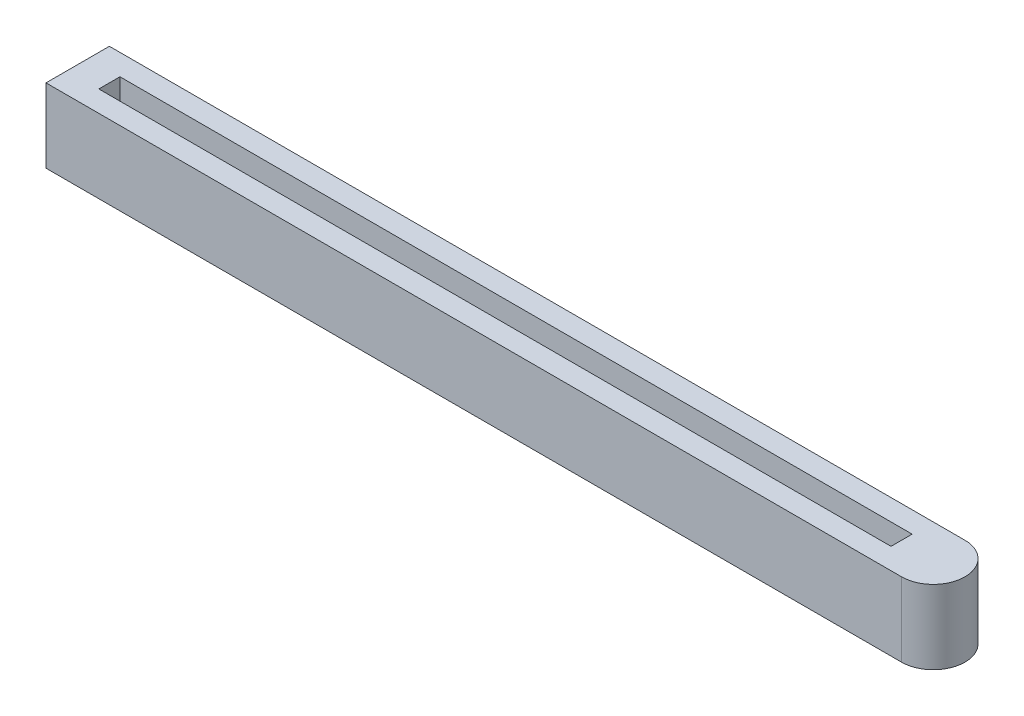
ISO-10303-21;
HEADER;
FILE_DESCRIPTION(('STEP AP214'),'2;1');
FILE_NAME('part.step','',(''),(''),'','','');
FILE_SCHEMA(('AUTOMOTIVE_DESIGN { 1 0 10303 214 1 1 1 1 }'));
ENDSEC;
DATA;
#1=APPLICATION_CONTEXT('core data for automotive mechanical design processes');
#2=APPLICATION_PROTOCOL_DEFINITION('international standard','automotive_design',2000,#1);
#3=PRODUCT_CONTEXT('',#1,'mechanical');
#4=PRODUCT('Part','Part','',(#3));
#5=PRODUCT_RELATED_PRODUCT_CATEGORY('part','',(#4));
#6=PRODUCT_DEFINITION_FORMATION('','',#4);
#7=PRODUCT_DEFINITION_CONTEXT('part definition',#1,'design');
#8=PRODUCT_DEFINITION('design','',#6,#7);
#9=PRODUCT_DEFINITION_SHAPE('','',#8);
#10=(LENGTH_UNIT() NAMED_UNIT(*) SI_UNIT(.MILLI.,.METRE.));
#11=(NAMED_UNIT(*) PLANE_ANGLE_UNIT() SI_UNIT($,.RADIAN.));
#12=(NAMED_UNIT(*) SI_UNIT($,.STERADIAN.) SOLID_ANGLE_UNIT());
#13=UNCERTAINTY_MEASURE_WITH_UNIT(LENGTH_MEASURE(1.E-05),#10,'distance_accuracy_value','');
#14=(GEOMETRIC_REPRESENTATION_CONTEXT(3) GLOBAL_UNCERTAINTY_ASSIGNED_CONTEXT((#13)) GLOBAL_UNIT_ASSIGNED_CONTEXT((#10,
#11,#12)) REPRESENTATION_CONTEXT('',''));
#15=CARTESIAN_POINT('',(0.,0.,0.));
#16=DIRECTION('',(0.,0.,1.));
#17=DIRECTION('',(1.,0.,0.));
#18=AXIS2_PLACEMENT_3D('',#15,#16,#17);
#19=CARTESIAN_POINT('',(0.,3.5,3.));
#20=DIRECTION('',(0.,0.,-1.));
#21=DIRECTION('',(-1.,0.,0.));
#22=AXIS2_PLACEMENT_3D('',#19,#20,#21);
#23=PLANE('',#22);
#24=DIRECTION('',(1.,0.,0.));
#25=VECTOR('',#24,1.);
#26=CARTESIAN_POINT('',(0.,0.,3.));
#27=LINE('',#26,#25);
#28=CARTESIAN_POINT('',(0.,0.,3.));
#29=VERTEX_POINT('',#28);
#30=CARTESIAN_POINT('',(40.5,0.,3.));
#31=VERTEX_POINT('',#30);
#32=EDGE_CURVE('E149',#29,#31,#27,.T.);
#33=ORIENTED_EDGE('',*,*,#32,.T.);
#34=DIRECTION('',(0.,-1.,0.));
#35=VECTOR('',#34,1.);
#36=CARTESIAN_POINT('',(40.5,3.5,3.));
#37=LINE('',#36,#35);
#38=CARTESIAN_POINT('',(40.5,3.5,3.));
#39=VERTEX_POINT('',#38);
#40=EDGE_CURVE('E11',#39,#31,#37,.T.);
#41=ORIENTED_EDGE('',*,*,#40,.F.);
#42=DIRECTION('',(1.,0.,0.));
#43=VECTOR('',#42,1.);
#44=CARTESIAN_POINT('',(0.,3.5,3.));
#45=LINE('',#44,#43);
#46=CARTESIAN_POINT('',(0.,3.5,3.));
#47=VERTEX_POINT('',#46);
#48=EDGE_CURVE('E153',#47,#39,#45,.T.);
#49=ORIENTED_EDGE('',*,*,#48,.F.);
#50=DIRECTION('',(0.,-1.,0.));
#51=VECTOR('',#50,1.);
#52=CARTESIAN_POINT('',(0.,3.5,3.));
#53=LINE('',#52,#51);
#54=EDGE_CURVE('E160',#47,#29,#53,.T.);
#55=ORIENTED_EDGE('',*,*,#54,.T.);
#56=EDGE_LOOP('',(#33,#41,#49,#55));
#57=FACE_BOUND('',#56,.T.);
#58=ADVANCED_FACE('F41',(#57),#23,.F.);
#59=CARTESIAN_POINT('',(40.5,3.5,1.5));
#60=DIRECTION('',(0.,-1.,0.));
#61=DIRECTION('',(0.,0.,-1.));
#62=AXIS2_PLACEMENT_3D('',#59,#60,#61);
#63=CYLINDRICAL_SURFACE('',#62,1.5);
#64=CARTESIAN_POINT('',(40.5,0.,1.5));
#65=DIRECTION('',(0.,1.,0.));
#66=DIRECTION('',(0.,0.,1.));
#67=AXIS2_PLACEMENT_3D('',#64,#65,#66);
#68=CIRCLE('',#67,1.5);
#69=CARTESIAN_POINT('',(40.5,0.,0.));
#70=VERTEX_POINT('',#69);
#71=EDGE_CURVE('E163',#31,#70,#68,.T.);
#72=ORIENTED_EDGE('',*,*,#71,.T.);
#73=DIRECTION('',(0.,-1.,0.));
#74=VECTOR('',#73,1.);
#75=CARTESIAN_POINT('',(40.5,3.5,0.));
#76=LINE('',#75,#74);
#77=CARTESIAN_POINT('',(40.5,3.5,0.));
#78=VERTEX_POINT('',#77);
#79=EDGE_CURVE('E48',#78,#70,#76,.T.);
#80=ORIENTED_EDGE('',*,*,#79,.F.);
#81=CARTESIAN_POINT('',(40.5,3.5,1.5));
#82=DIRECTION('',(0.,1.,0.));
#83=DIRECTION('',(0.,0.,1.));
#84=AXIS2_PLACEMENT_3D('',#81,#82,#83);
#85=CIRCLE('',#84,1.5);
#86=EDGE_CURVE('E92',#39,#78,#85,.T.);
#87=ORIENTED_EDGE('',*,*,#86,.F.);
#88=ORIENTED_EDGE('',*,*,#40,.T.);
#89=EDGE_LOOP('',(#72,#80,#87,#88));
#90=FACE_BOUND('',#89,.T.);
#91=ADVANCED_FACE('F175',(#90),#63,.T.);
#92=CARTESIAN_POINT('',(0.,3.5,0.));
#93=DIRECTION('',(0.,0.,-1.));
#94=DIRECTION('',(-1.,0.,0.));
#95=AXIS2_PLACEMENT_3D('',#92,#93,#94);
#96=PLANE('',#95);
#97=DIRECTION('',(1.,0.,0.));
#98=VECTOR('',#97,1.);
#99=CARTESIAN_POINT('',(0.,0.,0.));
#100=LINE('',#99,#98);
#101=CARTESIAN_POINT('',(0.,0.,0.));
#102=VERTEX_POINT('',#101);
#103=EDGE_CURVE('E166',#102,#70,#100,.T.);
#104=ORIENTED_EDGE('',*,*,#103,.F.);
#105=DIRECTION('',(0.,-1.,0.));
#106=VECTOR('',#105,1.);
#107=CARTESIAN_POINT('',(0.,3.5,0.));
#108=LINE('',#107,#106);
#109=CARTESIAN_POINT('',(0.,3.5,0.));
#110=VERTEX_POINT('',#109);
#111=EDGE_CURVE('E171',#110,#102,#108,.T.);
#112=ORIENTED_EDGE('',*,*,#111,.F.);
#113=DIRECTION('',(1.,0.,0.));
#114=VECTOR('',#113,1.);
#115=CARTESIAN_POINT('',(0.,3.5,0.));
#116=LINE('',#115,#114);
#117=EDGE_CURVE('E156',#110,#78,#116,.T.);
#118=ORIENTED_EDGE('',*,*,#117,.T.);
#119=ORIENTED_EDGE('',*,*,#79,.T.);
#120=EDGE_LOOP('',(#104,#112,#118,#119));
#121=FACE_BOUND('',#120,.T.);
#122=ADVANCED_FACE('F174',(#121),#96,.T.);
#123=CARTESIAN_POINT('',(0.,3.5,0.));
#124=DIRECTION('',(1.,0.,0.));
#125=DIRECTION('',(0.,0.,-1.));
#126=AXIS2_PLACEMENT_3D('',#123,#124,#125);
#127=PLANE('',#126);
#128=DIRECTION('',(0.,0.,1.));
#129=VECTOR('',#128,1.);
#130=CARTESIAN_POINT('',(0.,0.,0.));
#131=LINE('',#130,#129);
#132=EDGE_CURVE('E85',#102,#29,#131,.T.);
#133=ORIENTED_EDGE('',*,*,#132,.T.);
#134=ORIENTED_EDGE('',*,*,#54,.F.);
#135=DIRECTION('',(0.,0.,1.));
#136=VECTOR('',#135,1.);
#137=CARTESIAN_POINT('',(0.,3.5,0.));
#138=LINE('',#137,#136);
#139=EDGE_CURVE('E64',#110,#47,#138,.T.);
#140=ORIENTED_EDGE('',*,*,#139,.F.);
#141=ORIENTED_EDGE('',*,*,#111,.T.);
#142=EDGE_LOOP('',(#133,#134,#140,#141));
#143=FACE_BOUND('',#142,.T.);
#144=ADVANCED_FACE('F182',(#143),#127,.F.);
#145=CARTESIAN_POINT('',(0.,3.5,0.));
#146=DIRECTION('',(0.,1.,0.));
#147=DIRECTION('',(0.,0.,1.));
#148=AXIS2_PLACEMENT_3D('',#145,#146,#147);
#149=PLANE('',#148);
#150=DIRECTION('',(0.,0.,-1.));
#151=VECTOR('',#150,1.);
#152=CARTESIAN_POINT('',(39.0000000000009,3.5,1.99999999999823));
#153=LINE('',#152,#151);
#154=CARTESIAN_POINT('',(39.0000000000009,3.5,1.99999999999823));
#155=VERTEX_POINT('',#154);
#156=CARTESIAN_POINT('',(39.0000000000009,3.5,0.999999999998226));
#157=VERTEX_POINT('',#156);
#158=EDGE_CURVE('E55',#155,#157,#153,.T.);
#159=ORIENTED_EDGE('',*,*,#158,.F.);
#160=DIRECTION('',(1.,0.,0.));
#161=VECTOR('',#160,1.);
#162=CARTESIAN_POINT('',(39.0000000000009,3.5,1.99999999999823));
#163=LINE('',#162,#161);
#164=CARTESIAN_POINT('',(1.50000000000092,3.5,1.99999999999823));
#165=VERTEX_POINT('',#164);
#166=EDGE_CURVE('E134',#165,#155,#163,.T.);
#167=ORIENTED_EDGE('',*,*,#166,.F.);
#168=DIRECTION('',(0.,0.,1.));
#169=VECTOR('',#168,1.);
#170=CARTESIAN_POINT('',(1.50000000000092,3.5,1.99999999999823));
#171=LINE('',#170,#169);
#172=CARTESIAN_POINT('',(1.50000000000092,3.5,0.999999999998226));
#173=VERTEX_POINT('',#172);
#174=EDGE_CURVE('E137',#173,#165,#171,.T.);
#175=ORIENTED_EDGE('',*,*,#174,.F.);
#176=DIRECTION('',(-1.,0.,0.));
#177=VECTOR('',#176,1.);
#178=CARTESIAN_POINT('',(39.0000000000009,3.5,0.999999999998226));
#179=LINE('',#178,#177);
#180=EDGE_CURVE('E143',#157,#173,#179,.T.);
#181=ORIENTED_EDGE('',*,*,#180,.F.);
#182=EDGE_LOOP('',(#159,#167,#175,#181));
#183=FACE_BOUND('',#182,.T.);
#184=ORIENTED_EDGE('',*,*,#48,.T.);
#185=ORIENTED_EDGE('',*,*,#86,.T.);
#186=ORIENTED_EDGE('',*,*,#117,.F.);
#187=ORIENTED_EDGE('',*,*,#139,.T.);
#188=EDGE_LOOP('',(#184,#185,#186,#187));
#189=FACE_BOUND('',#188,.T.);
#190=ADVANCED_FACE('F183',(#183,#189),#149,.T.);
#191=CARTESIAN_POINT('',(0.,0.,0.));
#192=DIRECTION('',(0.,1.,0.));
#193=DIRECTION('',(0.,0.,1.));
#194=AXIS2_PLACEMENT_3D('',#191,#192,#193);
#195=PLANE('',#194);
#196=ORIENTED_EDGE('',*,*,#32,.F.);
#197=ORIENTED_EDGE('',*,*,#132,.F.);
#198=ORIENTED_EDGE('',*,*,#103,.T.);
#199=ORIENTED_EDGE('',*,*,#71,.F.);
#200=EDGE_LOOP('',(#196,#197,#198,#199));
#201=FACE_BOUND('',#200,.T.);
#202=ADVANCED_FACE('F179',(#201),#195,.F.);
#203=CARTESIAN_POINT('',(39.0000000000009,2.,1.99999999999823));
#204=DIRECTION('',(1.,0.,0.));
#205=DIRECTION('',(0.,0.,-1.));
#206=AXIS2_PLACEMENT_3D('',#203,#204,#205);
#207=PLANE('',#206);
#208=ORIENTED_EDGE('',*,*,#158,.T.);
#209=DIRECTION('',(0.,1.,0.));
#210=VECTOR('',#209,1.);
#211=CARTESIAN_POINT('',(39.0000000000009,2.,0.999999999998226));
#212=LINE('',#211,#210);
#213=CARTESIAN_POINT('',(39.0000000000009,2.,0.999999999998226));
#214=VERTEX_POINT('',#213);
#215=EDGE_CURVE('E112',#214,#157,#212,.T.);
#216=ORIENTED_EDGE('',*,*,#215,.F.);
#217=DIRECTION('',(0.,0.,-1.));
#218=VECTOR('',#217,1.);
#219=CARTESIAN_POINT('',(39.0000000000009,2.,1.99999999999823));
#220=LINE('',#219,#218);
#221=CARTESIAN_POINT('',(39.0000000000009,2.,1.99999999999823));
#222=VERTEX_POINT('',#221);
#223=EDGE_CURVE('E116',#222,#214,#220,.T.);
#224=ORIENTED_EDGE('',*,*,#223,.F.);
#225=DIRECTION('',(0.,1.,0.));
#226=VECTOR('',#225,1.);
#227=CARTESIAN_POINT('',(39.0000000000009,2.,1.99999999999823));
#228=LINE('',#227,#226);
#229=EDGE_CURVE('E147',#222,#155,#228,.T.);
#230=ORIENTED_EDGE('',*,*,#229,.T.);
#231=EDGE_LOOP('',(#208,#216,#224,#230));
#232=FACE_BOUND('',#231,.T.);
#233=ADVANCED_FACE('F114',(#232),#207,.F.);
#234=CARTESIAN_POINT('',(39.0000000000009,2.,1.99999999999823));
#235=DIRECTION('',(0.,0.,1.));
#236=DIRECTION('',(1.,0.,0.));
#237=AXIS2_PLACEMENT_3D('',#234,#235,#236);
#238=PLANE('',#237);
#239=ORIENTED_EDGE('',*,*,#166,.T.);
#240=ORIENTED_EDGE('',*,*,#229,.F.);
#241=DIRECTION('',(1.,0.,0.));
#242=VECTOR('',#241,1.);
#243=CARTESIAN_POINT('',(39.0000000000009,2.,1.99999999999823));
#244=LINE('',#243,#242);
#245=CARTESIAN_POINT('',(1.50000000000092,2.,1.99999999999823));
#246=VERTEX_POINT('',#245);
#247=EDGE_CURVE('E122',#246,#222,#244,.T.);
#248=ORIENTED_EDGE('',*,*,#247,.F.);
#249=DIRECTION('',(0.,1.,0.));
#250=VECTOR('',#249,1.);
#251=CARTESIAN_POINT('',(1.50000000000092,2.,1.99999999999823));
#252=LINE('',#251,#250);
#253=EDGE_CURVE('E150',#246,#165,#252,.T.);
#254=ORIENTED_EDGE('',*,*,#253,.T.);
#255=EDGE_LOOP('',(#239,#240,#248,#254));
#256=FACE_BOUND('',#255,.T.);
#257=ADVANCED_FACE('F224',(#256),#238,.F.);
#258=CARTESIAN_POINT('',(1.50000000000092,2.,1.99999999999823));
#259=DIRECTION('',(-1.,0.,0.));
#260=DIRECTION('',(0.,0.,1.));
#261=AXIS2_PLACEMENT_3D('',#258,#259,#260);
#262=PLANE('',#261);
#263=ORIENTED_EDGE('',*,*,#174,.T.);
#264=ORIENTED_EDGE('',*,*,#253,.F.);
#265=DIRECTION('',(0.,0.,1.));
#266=VECTOR('',#265,1.);
#267=CARTESIAN_POINT('',(1.50000000000092,2.,1.99999999999823));
#268=LINE('',#267,#266);
#269=CARTESIAN_POINT('',(1.50000000000092,2.,0.999999999998226));
#270=VERTEX_POINT('',#269);
#271=EDGE_CURVE('E130',#270,#246,#268,.T.);
#272=ORIENTED_EDGE('',*,*,#271,.F.);
#273=DIRECTION('',(0.,1.,0.));
#274=VECTOR('',#273,1.);
#275=CARTESIAN_POINT('',(1.50000000000092,2.,0.999999999998226));
#276=LINE('',#275,#274);
#277=EDGE_CURVE('E121',#270,#173,#276,.T.);
#278=ORIENTED_EDGE('',*,*,#277,.T.);
#279=EDGE_LOOP('',(#263,#264,#272,#278));
#280=FACE_BOUND('',#279,.T.);
#281=ADVANCED_FACE('F230',(#280),#262,.F.);
#282=CARTESIAN_POINT('',(39.0000000000009,2.,0.999999999998226));
#283=DIRECTION('',(0.,0.,-1.));
#284=DIRECTION('',(-1.,0.,0.));
#285=AXIS2_PLACEMENT_3D('',#282,#283,#284);
#286=PLANE('',#285);
#287=ORIENTED_EDGE('',*,*,#180,.T.);
#288=ORIENTED_EDGE('',*,*,#277,.F.);
#289=DIRECTION('',(-1.,0.,0.));
#290=VECTOR('',#289,1.);
#291=CARTESIAN_POINT('',(39.0000000000009,2.,0.999999999998226));
#292=LINE('',#291,#290);
#293=EDGE_CURVE('E125',#214,#270,#292,.T.);
#294=ORIENTED_EDGE('',*,*,#293,.F.);
#295=ORIENTED_EDGE('',*,*,#215,.T.);
#296=EDGE_LOOP('',(#287,#288,#294,#295));
#297=FACE_BOUND('',#296,.T.);
#298=ADVANCED_FACE('F126',(#297),#286,.F.);
#299=CARTESIAN_POINT('',(0.,2.,0.));
#300=DIRECTION('',(0.,1.,0.));
#301=DIRECTION('',(0.,0.,1.));
#302=AXIS2_PLACEMENT_3D('',#299,#300,#301);
#303=PLANE('',#302);
#304=ORIENTED_EDGE('',*,*,#223,.T.);
#305=ORIENTED_EDGE('',*,*,#293,.T.);
#306=ORIENTED_EDGE('',*,*,#271,.T.);
#307=ORIENTED_EDGE('',*,*,#247,.T.);
#308=EDGE_LOOP('',(#304,#305,#306,#307));
#309=FACE_BOUND('',#308,.T.);
#310=ADVANCED_FACE('F132',(#309),#303,.T.);
#311=CLOSED_SHELL('',(#58,#91,#122,#144,#190,#202,#233,#257,#281,#298,#310));
#312=MANIFOLD_SOLID_BREP('B2',#311);
#313=ADVANCED_BREP_SHAPE_REPRESENTATION('',(#18,#312),#14);
#314=SHAPE_DEFINITION_REPRESENTATION(#9,#313);
ENDSEC;
END-ISO-10303-21;
